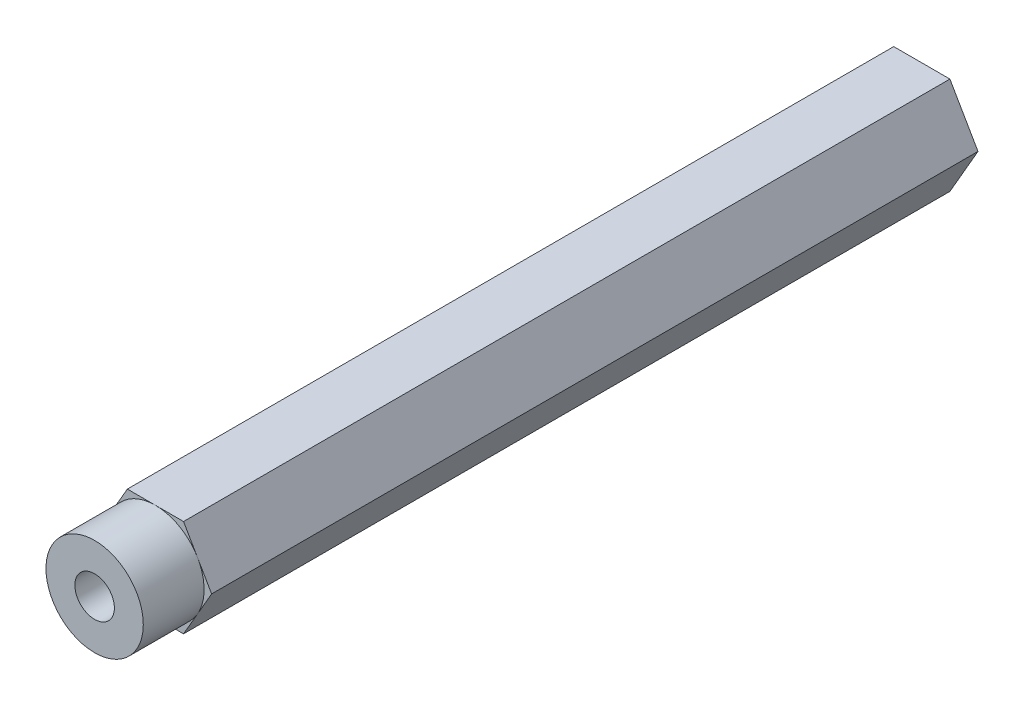
ISO-10303-21;
HEADER;
FILE_DESCRIPTION(('STEP AP214'),'2;1');
FILE_NAME('part.step','',(''),(''),'','','');
FILE_SCHEMA(('AUTOMOTIVE_DESIGN { 1 0 10303 214 1 1 1 1 }'));
ENDSEC;
DATA;
#1=APPLICATION_CONTEXT('core data for automotive mechanical design processes');
#2=APPLICATION_PROTOCOL_DEFINITION('international standard','automotive_design',2000,#1);
#3=PRODUCT_CONTEXT('',#1,'mechanical');
#4=PRODUCT('Part','Part','',(#3));
#5=PRODUCT_RELATED_PRODUCT_CATEGORY('part','',(#4));
#6=PRODUCT_DEFINITION_FORMATION('','',#4);
#7=PRODUCT_DEFINITION_CONTEXT('part definition',#1,'design');
#8=PRODUCT_DEFINITION('design','',#6,#7);
#9=PRODUCT_DEFINITION_SHAPE('','',#8);
#10=(LENGTH_UNIT() NAMED_UNIT(*) SI_UNIT(.MILLI.,.METRE.));
#11=(NAMED_UNIT(*) PLANE_ANGLE_UNIT() SI_UNIT($,.RADIAN.));
#12=(NAMED_UNIT(*) SI_UNIT($,.STERADIAN.) SOLID_ANGLE_UNIT());
#13=UNCERTAINTY_MEASURE_WITH_UNIT(LENGTH_MEASURE(1.E-05),#10,'distance_accuracy_value','');
#14=(GEOMETRIC_REPRESENTATION_CONTEXT(3) GLOBAL_UNCERTAINTY_ASSIGNED_CONTEXT((#13)) GLOBAL_UNIT_ASSIGNED_CONTEXT((#10,
#11,#12)) REPRESENTATION_CONTEXT('',''));
#15=CARTESIAN_POINT('',(0.,0.,0.));
#16=DIRECTION('',(0.,0.,1.));
#17=DIRECTION('',(1.,0.,0.));
#18=AXIS2_PLACEMENT_3D('',#15,#16,#17);
#19=CARTESIAN_POINT('',(0.,0.,100.0125));
#20=DIRECTION('',(0.,0.,1.));
#21=DIRECTION('',(1.,0.,0.));
#22=AXIS2_PLACEMENT_3D('',#19,#20,#21);
#23=PLANE('',#22);
#24=CARTESIAN_POINT('',(0.,0.,100.0125));
#25=DIRECTION('',(0.,0.,1.));
#26=DIRECTION('',(1.,0.,0.));
#27=AXIS2_PLACEMENT_3D('',#24,#25,#26);
#28=CIRCLE('',#27,6.34999999999997);
#29=CARTESIAN_POINT('',(5.49926131403116,3.17499999999999,100.0125));
#30=VERTEX_POINT('',#29);
#31=CARTESIAN_POINT('',(0.,6.34999999999997,100.0125));
#32=VERTEX_POINT('',#31);
#33=EDGE_CURVE('E51',#30,#32,#28,.T.);
#34=ORIENTED_EDGE('',*,*,#33,.F.);
#35=DIRECTION('',(-0.500000000000001,0.866025403784438,0.));
#36=VECTOR('',#35,1.);
#37=CARTESIAN_POINT('',(7.33234841870822,0.,100.0125));
#38=LINE('',#37,#36);
#39=CARTESIAN_POINT('',(3.6661742093541,6.34999999999999,100.0125));
#40=VERTEX_POINT('',#39);
#41=EDGE_CURVE('E127',#30,#40,#38,.T.);
#42=ORIENTED_EDGE('',*,*,#41,.T.);
#43=DIRECTION('',(-1.,0.,0.));
#44=VECTOR('',#43,1.);
#45=CARTESIAN_POINT('',(3.6661742093541,6.34999999999999,100.0125));
#46=LINE('',#45,#44);
#47=EDGE_CURVE('E140',#40,#32,#46,.T.);
#48=ORIENTED_EDGE('',*,*,#47,.T.);
#49=EDGE_LOOP('',(#34,#42,#48));
#50=FACE_BOUND('',#49,.T.);
#51=ADVANCED_FACE('F39',(#50),#23,.T.);
#52=CARTESIAN_POINT('',(-5.49926131403118,3.17499999999996,100.0125));
#53=VERTEX_POINT('',#52);
#54=EDGE_CURVE('E11',#32,#53,#28,.T.);
#55=ORIENTED_EDGE('',*,*,#54,.F.);
#56=CARTESIAN_POINT('',(-3.66617420935414,6.34999999999996,100.0125));
#57=VERTEX_POINT('',#56);
#58=EDGE_CURVE('E126',#32,#57,#46,.T.);
#59=ORIENTED_EDGE('',*,*,#58,.T.);
#60=DIRECTION('',(-0.499999999999995,-0.866025403784442,0.));
#61=VECTOR('',#60,1.);
#62=CARTESIAN_POINT('',(-3.66617420935414,6.34999999999996,100.0125));
#63=LINE('',#62,#61);
#64=EDGE_CURVE('E162',#57,#53,#63,.T.);
#65=ORIENTED_EDGE('',*,*,#64,.T.);
#66=EDGE_LOOP('',(#55,#59,#65));
#67=FACE_BOUND('',#66,.T.);
#68=ADVANCED_FACE('F236',(#67),#23,.T.);
#69=CARTESIAN_POINT('',(-5.49926131403114,-3.17500000000003,100.0125));
#70=VERTEX_POINT('',#69);
#71=EDGE_CURVE('E49',#53,#70,#28,.T.);
#72=ORIENTED_EDGE('',*,*,#71,.F.);
#73=CARTESIAN_POINT('',(-7.33234841870822,0.,100.0125));
#74=VERTEX_POINT('',#73);
#75=EDGE_CURVE('E161',#53,#74,#63,.T.);
#76=ORIENTED_EDGE('',*,*,#75,.T.);
#77=DIRECTION('',(0.500000000000007,-0.866025403784435,0.));
#78=VECTOR('',#77,1.);
#79=CARTESIAN_POINT('',(-7.33234841870822,0.,100.0125));
#80=LINE('',#79,#78);
#81=EDGE_CURVE('E167',#74,#70,#80,.T.);
#82=ORIENTED_EDGE('',*,*,#81,.T.);
#83=EDGE_LOOP('',(#72,#76,#82));
#84=FACE_BOUND('',#83,.T.);
#85=ADVANCED_FACE('F232',(#84),#23,.T.);
#86=CARTESIAN_POINT('',(0.,-6.34999999999997,100.0125));
#87=VERTEX_POINT('',#86);
#88=EDGE_CURVE('E66',#70,#87,#28,.T.);
#89=ORIENTED_EDGE('',*,*,#88,.F.);
#90=CARTESIAN_POINT('',(-3.66617420935405,-6.35000000000001,100.0125));
#91=VERTEX_POINT('',#90);
#92=EDGE_CURVE('E166',#70,#91,#80,.T.);
#93=ORIENTED_EDGE('',*,*,#92,.T.);
#94=DIRECTION('',(1.,0.,0.));
#95=VECTOR('',#94,1.);
#96=CARTESIAN_POINT('',(-3.66617420935405,-6.35000000000001,100.0125));
#97=LINE('',#96,#95);
#98=EDGE_CURVE('E172',#91,#87,#97,.T.);
#99=ORIENTED_EDGE('',*,*,#98,.T.);
#100=EDGE_LOOP('',(#89,#93,#99));
#101=FACE_BOUND('',#100,.T.);
#102=ADVANCED_FACE('F273',(#101),#23,.T.);
#103=CARTESIAN_POINT('',(5.4992613140312,-3.17499999999997,100.0125));
#104=VERTEX_POINT('',#103);
#105=EDGE_CURVE('E58',#87,#104,#28,.T.);
#106=ORIENTED_EDGE('',*,*,#105,.F.);
#107=CARTESIAN_POINT('',(3.66617420935418,-6.34999999999993,100.0125));
#108=VERTEX_POINT('',#107);
#109=EDGE_CURVE('E171',#87,#108,#97,.T.);
#110=ORIENTED_EDGE('',*,*,#109,.T.);
#111=DIRECTION('',(0.499999999999995,0.866025403784442,0.));
#112=VECTOR('',#111,1.);
#113=CARTESIAN_POINT('',(3.66617420935418,-6.34999999999993,100.0125));
#114=LINE('',#113,#112);
#115=EDGE_CURVE('E138',#108,#104,#114,.T.);
#116=ORIENTED_EDGE('',*,*,#115,.T.);
#117=EDGE_LOOP('',(#106,#110,#116));
#118=FACE_BOUND('',#117,.T.);
#119=ADVANCED_FACE('F268',(#118),#23,.T.);
#120=EDGE_CURVE('E119',#104,#30,#28,.T.);
#121=ORIENTED_EDGE('',*,*,#120,.F.);
#122=CARTESIAN_POINT('',(7.33234841870822,0.,100.0125));
#123=VERTEX_POINT('',#122);
#124=EDGE_CURVE('E121',#104,#123,#114,.T.);
#125=ORIENTED_EDGE('',*,*,#124,.T.);
#126=EDGE_CURVE('E115',#123,#30,#38,.T.);
#127=ORIENTED_EDGE('',*,*,#126,.T.);
#128=EDGE_LOOP('',(#121,#125,#127));
#129=FACE_BOUND('',#128,.T.);
#130=ADVANCED_FACE('F117',(#129),#23,.T.);
#131=CARTESIAN_POINT('',(0.,0.,0.));
#132=DIRECTION('',(0.,0.,1.));
#133=DIRECTION('',(1.,0.,0.));
#134=AXIS2_PLACEMENT_3D('',#131,#132,#133);
#135=PLANE('',#134);
#136=DIRECTION('',(0.499999999999995,0.866025403784442,0.));
#137=VECTOR('',#136,1.);
#138=CARTESIAN_POINT('',(3.66617420935418,-6.34999999999993,0.));
#139=LINE('',#138,#137);
#140=CARTESIAN_POINT('',(3.66617420935418,-6.34999999999993,0.));
#141=VERTEX_POINT('',#140);
#142=CARTESIAN_POINT('',(7.33234841870822,0.,0.));
#143=VERTEX_POINT('',#142);
#144=EDGE_CURVE('E156',#141,#143,#139,.T.);
#145=ORIENTED_EDGE('',*,*,#144,.F.);
#146=DIRECTION('',(1.,0.,0.));
#147=VECTOR('',#146,1.);
#148=CARTESIAN_POINT('',(-3.66617420935405,-6.35000000000001,0.));
#149=LINE('',#148,#147);
#150=CARTESIAN_POINT('',(-3.66617420935405,-6.35000000000001,0.));
#151=VERTEX_POINT('',#150);
#152=EDGE_CURVE('E191',#151,#141,#149,.T.);
#153=ORIENTED_EDGE('',*,*,#152,.F.);
#154=DIRECTION('',(0.500000000000007,-0.866025403784435,0.));
#155=VECTOR('',#154,1.);
#156=CARTESIAN_POINT('',(-7.33234841870822,0.,0.));
#157=LINE('',#156,#155);
#158=CARTESIAN_POINT('',(-7.33234841870822,0.,0.));
#159=VERTEX_POINT('',#158);
#160=EDGE_CURVE('E188',#159,#151,#157,.T.);
#161=ORIENTED_EDGE('',*,*,#160,.F.);
#162=DIRECTION('',(-0.499999999999995,-0.866025403784442,0.));
#163=VECTOR('',#162,1.);
#164=CARTESIAN_POINT('',(-3.66617420935414,6.34999999999996,0.));
#165=LINE('',#164,#163);
#166=CARTESIAN_POINT('',(-3.66617420935414,6.34999999999996,0.));
#167=VERTEX_POINT('',#166);
#168=EDGE_CURVE('E185',#167,#159,#165,.T.);
#169=ORIENTED_EDGE('',*,*,#168,.F.);
#170=DIRECTION('',(-1.,0.,0.));
#171=VECTOR('',#170,1.);
#172=CARTESIAN_POINT('',(3.6661742093541,6.34999999999999,0.));
#173=LINE('',#172,#171);
#174=CARTESIAN_POINT('',(3.6661742093541,6.34999999999999,0.));
#175=VERTEX_POINT('',#174);
#176=EDGE_CURVE('E182',#175,#167,#173,.T.);
#177=ORIENTED_EDGE('',*,*,#176,.F.);
#178=DIRECTION('',(-0.500000000000001,0.866025403784438,0.));
#179=VECTOR('',#178,1.);
#180=CARTESIAN_POINT('',(7.33234841870822,0.,0.));
#181=LINE('',#180,#179);
#182=EDGE_CURVE('E179',#143,#175,#181,.T.);
#183=ORIENTED_EDGE('',*,*,#182,.F.);
#184=EDGE_LOOP('',(#145,#153,#161,#169,#177,#183));
#185=FACE_BOUND('',#184,.T.);
#186=CARTESIAN_POINT('',(0.,0.,0.));
#187=DIRECTION('',(0.,0.,1.));
#188=DIRECTION('',(1.,0.,0.));
#189=AXIS2_PLACEMENT_3D('',#186,#187,#188);
#190=CIRCLE('',#189,2.5796875);
#191=CARTESIAN_POINT('',(-2.5796875,0.,0.));
#192=VERTEX_POINT('',#191);
#193=EDGE_CURVE('E152',#192,#192,#190,.T.);
#194=ORIENTED_EDGE('',*,*,#193,.T.);
#195=EDGE_LOOP('',(#194));
#196=FACE_BOUND('',#195,.T.);
#197=ADVANCED_FACE('F217',(#185,#196),#135,.F.);
#198=CARTESIAN_POINT('',(3.66617420935418,-6.34999999999993,100.0125));
#199=DIRECTION('',(-0.866025403784441,0.499999999999995,0.));
#200=DIRECTION('',(-0.499999999999995,-0.866025403784442,0.));
#201=AXIS2_PLACEMENT_3D('',#198,#199,#200);
#202=PLANE('',#201);
#203=ORIENTED_EDGE('',*,*,#144,.T.);
#204=DIRECTION('',(0.,0.,-1.));
#205=VECTOR('',#204,1.);
#206=CARTESIAN_POINT('',(7.33234841870822,0.,100.0125));
#207=LINE('',#206,#205);
#208=EDGE_CURVE('E43',#123,#143,#207,.T.);
#209=ORIENTED_EDGE('',*,*,#208,.F.);
#210=ORIENTED_EDGE('',*,*,#124,.F.);
#211=ORIENTED_EDGE('',*,*,#115,.F.);
#212=DIRECTION('',(0.,0.,-1.));
#213=VECTOR('',#212,1.);
#214=CARTESIAN_POINT('',(3.66617420935418,-6.34999999999993,100.0125));
#215=LINE('',#214,#213);
#216=EDGE_CURVE('E175',#108,#141,#215,.T.);
#217=ORIENTED_EDGE('',*,*,#216,.T.);
#218=EDGE_LOOP('',(#203,#209,#210,#211,#217));
#219=FACE_BOUND('',#218,.T.);
#220=ADVANCED_FACE('F41',(#219),#202,.F.);
#221=CARTESIAN_POINT('',(7.33234841870822,0.,100.0125));
#222=DIRECTION('',(-0.866025403784438,-0.500000000000001,0.));
#223=DIRECTION('',(0.500000000000001,-0.866025403784438,0.));
#224=AXIS2_PLACEMENT_3D('',#221,#222,#223);
#225=PLANE('',#224);
#226=ORIENTED_EDGE('',*,*,#182,.T.);
#227=DIRECTION('',(0.,0.,-1.));
#228=VECTOR('',#227,1.);
#229=CARTESIAN_POINT('',(3.6661742093541,6.34999999999999,100.0125));
#230=LINE('',#229,#228);
#231=EDGE_CURVE('E133',#40,#175,#230,.T.);
#232=ORIENTED_EDGE('',*,*,#231,.F.);
#233=ORIENTED_EDGE('',*,*,#41,.F.);
#234=ORIENTED_EDGE('',*,*,#126,.F.);
#235=ORIENTED_EDGE('',*,*,#208,.T.);
#236=EDGE_LOOP('',(#226,#232,#233,#234,#235));
#237=FACE_BOUND('',#236,.T.);
#238=ADVANCED_FACE('F131',(#237),#225,.F.);
#239=CARTESIAN_POINT('',(3.6661742093541,6.34999999999999,100.0125));
#240=DIRECTION('',(0.,-1.,0.));
#241=DIRECTION('',(1.,0.,0.));
#242=AXIS2_PLACEMENT_3D('',#239,#240,#241);
#243=PLANE('',#242);
#244=ORIENTED_EDGE('',*,*,#176,.T.);
#245=DIRECTION('',(0.,0.,-1.));
#246=VECTOR('',#245,1.);
#247=CARTESIAN_POINT('',(-3.66617420935414,6.34999999999996,100.0125));
#248=LINE('',#247,#246);
#249=EDGE_CURVE('E205',#57,#167,#248,.T.);
#250=ORIENTED_EDGE('',*,*,#249,.F.);
#251=ORIENTED_EDGE('',*,*,#58,.F.);
#252=ORIENTED_EDGE('',*,*,#47,.F.);
#253=ORIENTED_EDGE('',*,*,#231,.T.);
#254=EDGE_LOOP('',(#244,#250,#251,#252,#253));
#255=FACE_BOUND('',#254,.T.);
#256=ADVANCED_FACE('F211',(#255),#243,.F.);
#257=CARTESIAN_POINT('',(-3.66617420935414,6.34999999999996,100.0125));
#258=DIRECTION('',(0.866025403784441,-0.499999999999995,0.));
#259=DIRECTION('',(0.499999999999995,0.866025403784441,0.));
#260=AXIS2_PLACEMENT_3D('',#257,#258,#259);
#261=PLANE('',#260);
#262=ORIENTED_EDGE('',*,*,#168,.T.);
#263=DIRECTION('',(0.,0.,-1.));
#264=VECTOR('',#263,1.);
#265=CARTESIAN_POINT('',(-7.33234841870822,0.,100.0125));
#266=LINE('',#265,#264);
#267=EDGE_CURVE('E201',#74,#159,#266,.T.);
#268=ORIENTED_EDGE('',*,*,#267,.F.);
#269=ORIENTED_EDGE('',*,*,#75,.F.);
#270=ORIENTED_EDGE('',*,*,#64,.F.);
#271=ORIENTED_EDGE('',*,*,#249,.T.);
#272=EDGE_LOOP('',(#262,#268,#269,#270,#271));
#273=FACE_BOUND('',#272,.T.);
#274=ADVANCED_FACE('F223',(#273),#261,.F.);
#275=CARTESIAN_POINT('',(-7.33234841870822,0.,100.0125));
#276=DIRECTION('',(0.866025403784435,0.500000000000007,0.));
#277=DIRECTION('',(-0.500000000000007,0.866025403784435,0.));
#278=AXIS2_PLACEMENT_3D('',#275,#276,#277);
#279=PLANE('',#278);
#280=ORIENTED_EDGE('',*,*,#160,.T.);
#281=DIRECTION('',(0.,0.,-1.));
#282=VECTOR('',#281,1.);
#283=CARTESIAN_POINT('',(-3.66617420935405,-6.35000000000001,100.0125));
#284=LINE('',#283,#282);
#285=EDGE_CURVE('E197',#91,#151,#284,.T.);
#286=ORIENTED_EDGE('',*,*,#285,.F.);
#287=ORIENTED_EDGE('',*,*,#92,.F.);
#288=ORIENTED_EDGE('',*,*,#81,.F.);
#289=ORIENTED_EDGE('',*,*,#267,.T.);
#290=EDGE_LOOP('',(#280,#286,#287,#288,#289));
#291=FACE_BOUND('',#290,.T.);
#292=ADVANCED_FACE('F228',(#291),#279,.F.);
#293=CARTESIAN_POINT('',(-3.66617420935405,-6.35000000000001,100.0125));
#294=DIRECTION('',(0.,1.,0.));
#295=DIRECTION('',(-1.,0.,0.));
#296=AXIS2_PLACEMENT_3D('',#293,#294,#295);
#297=PLANE('',#296);
#298=ORIENTED_EDGE('',*,*,#152,.T.);
#299=ORIENTED_EDGE('',*,*,#216,.F.);
#300=ORIENTED_EDGE('',*,*,#109,.F.);
#301=ORIENTED_EDGE('',*,*,#98,.F.);
#302=ORIENTED_EDGE('',*,*,#285,.T.);
#303=EDGE_LOOP('',(#298,#299,#300,#301,#302));
#304=FACE_BOUND('',#303,.T.);
#305=ADVANCED_FACE('F258',(#304),#297,.F.);
#306=CARTESIAN_POINT('',(0.,0.,100.0125));
#307=DIRECTION('',(0.,0.,-1.));
#308=DIRECTION('',(-1.,0.,0.));
#309=AXIS2_PLACEMENT_3D('',#306,#307,#308);
#310=CYLINDRICAL_SURFACE('',#309,2.5796875);
#311=CARTESIAN_POINT('',(0.,0.,107.95));
#312=DIRECTION('',(0.,0.,1.));
#313=DIRECTION('',(1.,0.,0.));
#314=AXIS2_PLACEMENT_3D('',#311,#312,#313);
#315=CIRCLE('',#314,2.5796875);
#316=CARTESIAN_POINT('',(-2.5796875,0.,107.95));
#317=VERTEX_POINT('',#316);
#318=EDGE_CURVE('E144',#317,#317,#315,.T.);
#319=CARTESIAN_POINT('',(-2.5796875,0.,0.));
#320=CARTESIAN_POINT('',(-2.5796875,0.,1.12447916666666));
#321=CARTESIAN_POINT('',(-2.5796875,0.,2.24895833333333));
#322=CARTESIAN_POINT('',(-2.5796875,0.,4.49791666666666));
#323=CARTESIAN_POINT('',(-2.5796875,0.,5.62239583333333));
#324=CARTESIAN_POINT('',(-2.5796875,0.,7.87135416666667));
#325=CARTESIAN_POINT('',(-2.5796875,0.,8.99583333333334));
#326=CARTESIAN_POINT('',(-2.5796875,0.,11.2447916666667));
#327=CARTESIAN_POINT('',(-2.5796875,0.,12.3692708333333));
#328=CARTESIAN_POINT('',(-2.5796875,0.,14.6182291666667));
#329=CARTESIAN_POINT('',(-2.5796875,0.,15.7427083333333));
#330=CARTESIAN_POINT('',(-2.5796875,0.,17.9916666666667));
#331=CARTESIAN_POINT('',(-2.5796875,0.,19.1161458333333));
#332=CARTESIAN_POINT('',(-2.5796875,0.,21.3651041666667));
#333=CARTESIAN_POINT('',(-2.5796875,0.,22.4895833333333));
#334=CARTESIAN_POINT('',(-2.5796875,0.,24.7385416666667));
#335=CARTESIAN_POINT('',(-2.5796875,0.,25.8630208333333));
#336=CARTESIAN_POINT('',(-2.5796875,0.,28.1119791666667));
#337=CARTESIAN_POINT('',(-2.5796875,0.,29.2364583333333));
#338=CARTESIAN_POINT('',(-2.5796875,0.,31.4854166666667));
#339=CARTESIAN_POINT('',(-2.5796875,0.,32.6098958333333));
#340=CARTESIAN_POINT('',(-2.5796875,0.,34.8588541666667));
#341=CARTESIAN_POINT('',(-2.5796875,0.,35.9833333333333));
#342=CARTESIAN_POINT('',(-2.5796875,0.,38.2322916666667));
#343=CARTESIAN_POINT('',(-2.5796875,0.,39.3567708333333));
#344=CARTESIAN_POINT('',(-2.5796875,0.,41.6057291666667));
#345=CARTESIAN_POINT('',(-2.5796875,0.,42.7302083333333));
#346=CARTESIAN_POINT('',(-2.5796875,0.,44.9791666666667));
#347=CARTESIAN_POINT('',(-2.5796875,0.,46.1036458333333));
#348=CARTESIAN_POINT('',(-2.5796875,0.,48.3526041666667));
#349=CARTESIAN_POINT('',(-2.5796875,0.,49.4770833333333));
#350=CARTESIAN_POINT('',(-2.5796875,0.,51.7260416666667));
#351=CARTESIAN_POINT('',(-2.5796875,0.,52.8505208333333));
#352=CARTESIAN_POINT('',(-2.5796875,0.,55.0994791666667));
#353=CARTESIAN_POINT('',(-2.5796875,0.,56.2239583333333));
#354=CARTESIAN_POINT('',(-2.5796875,0.,58.4729166666666));
#355=CARTESIAN_POINT('',(-2.5796875,0.,59.5973958333333));
#356=CARTESIAN_POINT('',(-2.5796875,0.,61.8463541666667));
#357=CARTESIAN_POINT('',(-2.5796875,0.,62.9708333333333));
#358=CARTESIAN_POINT('',(-2.5796875,0.,65.2197916666667));
#359=CARTESIAN_POINT('',(-2.5796875,0.,66.3442708333333));
#360=CARTESIAN_POINT('',(-2.5796875,0.,68.5932291666667));
#361=CARTESIAN_POINT('',(-2.5796875,0.,69.7177083333333));
#362=CARTESIAN_POINT('',(-2.5796875,0.,71.9666666666666));
#363=CARTESIAN_POINT('',(-2.5796875,0.,73.0911458333333));
#364=CARTESIAN_POINT('',(-2.5796875,0.,75.3401041666666));
#365=CARTESIAN_POINT('',(-2.5796875,0.,76.4645833333333));
#366=CARTESIAN_POINT('',(-2.5796875,0.,78.7135416666667));
#367=CARTESIAN_POINT('',(-2.5796875,0.,79.8380208333333));
#368=CARTESIAN_POINT('',(-2.5796875,0.,82.0869791666666));
#369=CARTESIAN_POINT('',(-2.5796875,0.,83.2114583333333));
#370=CARTESIAN_POINT('',(-2.5796875,0.,85.4604166666666));
#371=CARTESIAN_POINT('',(-2.5796875,0.,86.5848958333333));
#372=CARTESIAN_POINT('',(-2.5796875,0.,88.8338541666666));
#373=CARTESIAN_POINT('',(-2.5796875,0.,89.9583333333333));
#374=CARTESIAN_POINT('',(-2.5796875,0.,92.2072916666666));
#375=CARTESIAN_POINT('',(-2.5796875,0.,93.3317708333333));
#376=CARTESIAN_POINT('',(-2.5796875,0.,95.5807291666666));
#377=CARTESIAN_POINT('',(-2.5796875,0.,96.7052083333333));
#378=CARTESIAN_POINT('',(-2.5796875,0.,98.9541666666666));
#379=CARTESIAN_POINT('',(-2.5796875,0.,100.078645833333));
#380=CARTESIAN_POINT('',(-2.5796875,0.,102.327604166667));
#381=CARTESIAN_POINT('',(-2.5796875,0.,103.452083333333));
#382=CARTESIAN_POINT('',(-2.5796875,0.,105.701041666667));
#383=CARTESIAN_POINT('',(-2.5796875,0.,106.825520833333));
#384=CARTESIAN_POINT('',(-2.5796875,0.,107.95));
#385=B_SPLINE_CURVE_WITH_KNOTS('',3,(#319,#320,#321,#322,#323,#324,#325,#326,#327,#328,#329,
#330,#331,#332,#333,#334,#335,#336,#337,#338,#339,#340,#341,#342,#343,#344,#345,#346,#347,#348,
#349,#350,#351,#352,#353,#354,#355,#356,#357,#358,#359,#360,#361,#362,#363,#364,#365,#366,#367,
#368,#369,#370,#371,#372,#373,#374,#375,#376,#377,#378,#379,#380,#381,#382,#383,#384),
.UNSPECIFIED.,.F.,.F.,(4,2,2,2,2,2,2,2,2,2,2,2,2,2,2,2,2,2,2,2,2,2,2,2,2,2,2,2,2,2,2,2,4),(0.,
3.37343749999999,6.746875,10.1203125,13.49375,16.8671875,20.240625,23.6140625,26.9875,
30.3609375,33.734375,37.1078125,40.48125,43.8546875,47.228125,50.6015625,53.975,57.3484375,
60.721875,64.0953125,67.46875,70.8421875,74.215625,77.5890625,80.9625,84.3359375,87.709375,
91.0828125,94.45625,97.8296875,101.203125,104.5765625,107.95),.UNSPECIFIED.);
#386=EDGE_CURVE('BSEAM246',#192,#317,#385,.T.);
#387=ORIENTED_EDGE('',*,*,#193,.F.);
#388=ORIENTED_EDGE('',*,*,#318,.T.);
#389=ORIENTED_EDGE('',*,*,#386,.T.);
#390=ORIENTED_EDGE('',*,*,#386,.F.);
#391=EDGE_LOOP('',(#387,#389,#388,#390));
#392=FACE_BOUND('',#391,.T.);
#393=ADVANCED_FACE('F246',(#392),#310,.F.);
#394=CARTESIAN_POINT('',(0.,0.,107.95));
#395=DIRECTION('',(0.,0.,1.));
#396=DIRECTION('',(1.,0.,0.));
#397=AXIS2_PLACEMENT_3D('',#394,#395,#396);
#398=PLANE('',#397);
#399=CARTESIAN_POINT('',(0.,0.,107.95));
#400=DIRECTION('',(0.,0.,1.));
#401=DIRECTION('',(1.,0.,0.));
#402=AXIS2_PLACEMENT_3D('',#399,#400,#401);
#403=CIRCLE('',#402,6.34999999999997);
#404=CARTESIAN_POINT('',(6.34999999999997,0.,107.95));
#405=VERTEX_POINT('',#404);
#406=EDGE_CURVE('E143',#405,#405,#403,.T.);
#407=ORIENTED_EDGE('',*,*,#406,.T.);
#408=EDGE_LOOP('',(#407));
#409=FACE_BOUND('',#408,.T.);
#410=ORIENTED_EDGE('',*,*,#318,.F.);
#411=EDGE_LOOP('',(#410));
#412=FACE_BOUND('',#411,.T.);
#413=ADVANCED_FACE('F248',(#409,#412),#398,.T.);
#414=CARTESIAN_POINT('',(0.,0.,107.95));
#415=DIRECTION('',(0.,0.,-1.));
#416=DIRECTION('',(-1.,0.,0.));
#417=AXIS2_PLACEMENT_3D('',#414,#415,#416);
#418=CYLINDRICAL_SURFACE('',#417,6.34999999999997);
#419=ORIENTED_EDGE('',*,*,#406,.F.);
#420=EDGE_LOOP('',(#419));
#421=FACE_BOUND('',#420,.T.);
#422=ORIENTED_EDGE('',*,*,#33,.T.);
#423=ORIENTED_EDGE('',*,*,#54,.T.);
#424=ORIENTED_EDGE('',*,*,#71,.T.);
#425=ORIENTED_EDGE('',*,*,#88,.T.);
#426=ORIENTED_EDGE('',*,*,#105,.T.);
#427=ORIENTED_EDGE('',*,*,#120,.T.);
#428=EDGE_LOOP('',(#422,#423,#424,#425,#426,#427));
#429=FACE_BOUND('',#428,.T.);
#430=ADVANCED_FACE('F145',(#421,#429),#418,.T.);
#431=CLOSED_SHELL('',(#51,#68,#85,#102,#119,#130,#197,#220,#238,#256,#274,#292,#305,#393,#413,#430));
#432=MANIFOLD_SOLID_BREP('B2',#431);
#433=ADVANCED_BREP_SHAPE_REPRESENTATION('',(#18,#432),#14);
#434=SHAPE_DEFINITION_REPRESENTATION(#9,#433);
ENDSEC;
END-ISO-10303-21;
